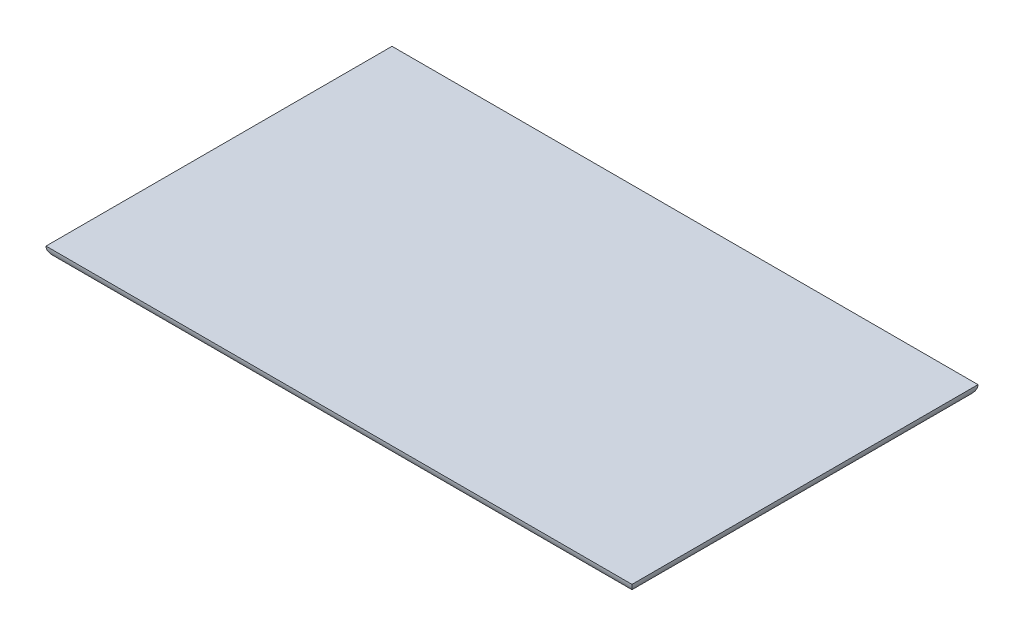
ISO-10303-21;
HEADER;
FILE_DESCRIPTION(('STEP AP214'),'2;1');
FILE_NAME('part.step','',(''),(''),'','','');
FILE_SCHEMA(('AUTOMOTIVE_DESIGN { 1 0 10303 214 1 1 1 1 }'));
ENDSEC;
DATA;
#1=APPLICATION_CONTEXT('core data for automotive mechanical design processes');
#2=APPLICATION_PROTOCOL_DEFINITION('international standard','automotive_design',2000,#1);
#3=PRODUCT_CONTEXT('',#1,'mechanical');
#4=PRODUCT('Part','Part','',(#3));
#5=PRODUCT_RELATED_PRODUCT_CATEGORY('part','',(#4));
#6=PRODUCT_DEFINITION_FORMATION('','',#4);
#7=PRODUCT_DEFINITION_CONTEXT('part definition',#1,'design');
#8=PRODUCT_DEFINITION('design','',#6,#7);
#9=PRODUCT_DEFINITION_SHAPE('','',#8);
#10=(LENGTH_UNIT() NAMED_UNIT(*) SI_UNIT(.MILLI.,.METRE.));
#11=(NAMED_UNIT(*) PLANE_ANGLE_UNIT() SI_UNIT($,.RADIAN.));
#12=(NAMED_UNIT(*) SI_UNIT($,.STERADIAN.) SOLID_ANGLE_UNIT());
#13=UNCERTAINTY_MEASURE_WITH_UNIT(LENGTH_MEASURE(1.E-05),#10,'distance_accuracy_value','');
#14=(GEOMETRIC_REPRESENTATION_CONTEXT(3) GLOBAL_UNCERTAINTY_ASSIGNED_CONTEXT((#13)) GLOBAL_UNIT_ASSIGNED_CONTEXT((#10,
#11,#12)) REPRESENTATION_CONTEXT('',''));
#15=CARTESIAN_POINT('',(0.,0.,0.));
#16=DIRECTION('',(0.,0.,1.));
#17=DIRECTION('',(1.,0.,0.));
#18=AXIS2_PLACEMENT_3D('',#15,#16,#17);
#19=CARTESIAN_POINT('',(0.,2.,0.));
#20=DIRECTION('',(0.,1.,0.));
#21=DIRECTION('',(0.,0.,1.));
#22=AXIS2_PLACEMENT_3D('',#19,#20,#21);
#23=PLANE('',#22);
#24=DIRECTION('',(0.,0.,1.));
#25=VECTOR('',#24,1.);
#26=CARTESIAN_POINT('',(-49.4372039865158,2.,33.7793314440381));
#27=LINE('',#26,#25);
#28=CARTESIAN_POINT('',(-49.4372039865158,2.,-28.2206685534449));
#29=VERTEX_POINT('',#28);
#30=CARTESIAN_POINT('',(-49.4372039865158,2.,33.7793314440381));
#31=VERTEX_POINT('',#30);
#32=EDGE_CURVE('E74',#29,#31,#27,.T.);
#33=ORIENTED_EDGE('',*,*,#32,.T.);
#34=DIRECTION('',(1.,0.,0.));
#35=VECTOR('',#34,1.);
#36=CARTESIAN_POINT('',(55.5627960109672,2.,33.7793314440381));
#37=LINE('',#36,#35);
#38=CARTESIAN_POINT('',(55.5627960109672,2.,33.7793314440381));
#39=VERTEX_POINT('',#38);
#40=EDGE_CURVE('E77',#31,#39,#37,.T.);
#41=ORIENTED_EDGE('',*,*,#40,.T.);
#42=DIRECTION('',(0.,0.,-1.));
#43=VECTOR('',#42,1.);
#44=CARTESIAN_POINT('',(55.5627960109672,2.,33.7793314440381));
#45=LINE('',#44,#43);
#46=CARTESIAN_POINT('',(55.5627960109672,2.,-28.2206685534449));
#47=VERTEX_POINT('',#46);
#48=EDGE_CURVE('E95',#39,#47,#45,.T.);
#49=ORIENTED_EDGE('',*,*,#48,.T.);
#50=DIRECTION('',(-1.,0.,0.));
#51=VECTOR('',#50,1.);
#52=CARTESIAN_POINT('',(55.5627960109672,2.,-28.2206685534449));
#53=LINE('',#52,#51);
#54=EDGE_CURVE('E79',#47,#29,#53,.T.);
#55=ORIENTED_EDGE('',*,*,#54,.T.);
#56=EDGE_LOOP('',(#33,#41,#49,#55));
#57=FACE_BOUND('',#56,.T.);
#58=ADVANCED_FACE('F33',(#57),#23,.T.);
#59=CARTESIAN_POINT('',(0.,0.,0.));
#60=DIRECTION('',(0.,1.,0.));
#61=DIRECTION('',(0.,0.,1.));
#62=AXIS2_PLACEMENT_3D('',#59,#60,#61);
#63=PLANE('',#62);
#64=DIRECTION('',(0.,0.,-1.));
#65=VECTOR('',#64,1.);
#66=CARTESIAN_POINT('',(53.5627960109672,0.,0.));
#67=LINE('',#66,#65);
#68=CARTESIAN_POINT('',(53.5627960109672,0.,-26.2206685534449));
#69=VERTEX_POINT('',#68);
#70=CARTESIAN_POINT('',(53.5627960109672,0.,31.7793314440381));
#71=VERTEX_POINT('',#70);
#72=EDGE_CURVE('E42',#69,#71,#67,.F.);
#73=ORIENTED_EDGE('',*,*,#72,.T.);
#74=DIRECTION('',(1.,0.,0.));
#75=VECTOR('',#74,1.);
#76=CARTESIAN_POINT('',(0.,0.,31.7793314440381));
#77=LINE('',#76,#75);
#78=CARTESIAN_POINT('',(-47.4372039865158,0.,31.7793314440381));
#79=VERTEX_POINT('',#78);
#80=EDGE_CURVE('E11',#71,#79,#77,.F.);
#81=ORIENTED_EDGE('',*,*,#80,.T.);
#82=DIRECTION('',(0.,0.,1.));
#83=VECTOR('',#82,1.);
#84=CARTESIAN_POINT('',(-47.4372039865158,0.,0.));
#85=LINE('',#84,#83);
#86=CARTESIAN_POINT('',(-47.4372039865158,0.,-26.2206685534449));
#87=VERTEX_POINT('',#86);
#88=EDGE_CURVE('E87',#79,#87,#85,.F.);
#89=ORIENTED_EDGE('',*,*,#88,.T.);
#90=DIRECTION('',(-1.,0.,0.));
#91=VECTOR('',#90,1.);
#92=CARTESIAN_POINT('',(0.,0.,-26.2206685534449));
#93=LINE('',#92,#91);
#94=EDGE_CURVE('E53',#87,#69,#93,.F.);
#95=ORIENTED_EDGE('',*,*,#94,.T.);
#96=EDGE_LOOP('',(#73,#81,#89,#95));
#97=FACE_BOUND('',#96,.T.);
#98=ADVANCED_FACE('F115',(#97),#63,.F.);
#99=CARTESIAN_POINT('',(55.5627960109672,2.,-26.2206685534449));
#100=DIRECTION('',(-1.,0.,0.));
#101=DIRECTION('',(0.,0.,1.));
#102=AXIS2_PLACEMENT_3D('',#99,#100,#101);
#103=CYLINDRICAL_SURFACE('',#102,2.);
#104=CARTESIAN_POINT('',(53.5627960109672,2.,-26.2206685534449));
#105=DIRECTION('',(-0.707106781186547,0.,-0.707106781186548));
#106=DIRECTION('',(-0.707106781186548,0.,0.707106781186547));
#107=AXIS2_PLACEMENT_3D('',#104,#105,#106);
#108=ELLIPSE('',#107,2.82842712474619,2.);
#109=EDGE_CURVE('E89',#69,#47,#108,.F.);
#110=ORIENTED_EDGE('',*,*,#109,.F.);
#111=ORIENTED_EDGE('',*,*,#94,.F.);
#112=CARTESIAN_POINT('',(-47.4372039865158,2.,-26.2206685534449));
#113=DIRECTION('',(-0.707106781186547,0.,0.707106781186547));
#114=DIRECTION('',(0.707106781186547,0.,0.707106781186547));
#115=AXIS2_PLACEMENT_3D('',#112,#113,#114);
#116=ELLIPSE('',#115,2.82842712474619,2.);
#117=EDGE_CURVE('E37',#29,#87,#116,.T.);
#118=ORIENTED_EDGE('',*,*,#117,.F.);
#119=ORIENTED_EDGE('',*,*,#54,.F.);
#120=EDGE_LOOP('',(#110,#111,#118,#119));
#121=FACE_BOUND('',#120,.T.);
#122=ADVANCED_FACE('F35',(#121),#103,.T.);
#123=CARTESIAN_POINT('',(-47.4372039865158,2.,33.7793314440381));
#124=DIRECTION('',(0.,0.,1.));
#125=DIRECTION('',(1.,0.,0.));
#126=AXIS2_PLACEMENT_3D('',#123,#124,#125);
#127=CYLINDRICAL_SURFACE('',#126,2.);
#128=ORIENTED_EDGE('',*,*,#117,.T.);
#129=ORIENTED_EDGE('',*,*,#88,.F.);
#130=CARTESIAN_POINT('',(-47.4372039865158,2.,31.7793314440381));
#131=DIRECTION('',(0.707106781186548,0.,0.707106781186547));
#132=DIRECTION('',(-0.707106781186547,0.,0.707106781186548));
#133=AXIS2_PLACEMENT_3D('',#130,#131,#132);
#134=ELLIPSE('',#133,2.82842712474619,2.);
#135=EDGE_CURVE('E85',#31,#79,#134,.T.);
#136=ORIENTED_EDGE('',*,*,#135,.F.);
#137=ORIENTED_EDGE('',*,*,#32,.F.);
#138=EDGE_LOOP('',(#128,#129,#136,#137));
#139=FACE_BOUND('',#138,.T.);
#140=ADVANCED_FACE('F86',(#139),#127,.T.);
#141=CARTESIAN_POINT('',(53.5627960109672,2.,33.7793314440381));
#142=DIRECTION('',(0.,0.,-1.));
#143=DIRECTION('',(-1.,0.,0.));
#144=AXIS2_PLACEMENT_3D('',#141,#142,#143);
#145=CYLINDRICAL_SURFACE('',#144,2.);
#146=ORIENTED_EDGE('',*,*,#109,.T.);
#147=ORIENTED_EDGE('',*,*,#48,.F.);
#148=CARTESIAN_POINT('',(53.5627960109672,2.,31.7793314440381));
#149=DIRECTION('',(0.707106781186547,0.,-0.707106781186547));
#150=DIRECTION('',(-0.707106781186547,0.,-0.707106781186547));
#151=AXIS2_PLACEMENT_3D('',#148,#149,#150);
#152=ELLIPSE('',#151,2.82842712474619,2.);
#153=EDGE_CURVE('E90',#71,#39,#152,.F.);
#154=ORIENTED_EDGE('',*,*,#153,.F.);
#155=ORIENTED_EDGE('',*,*,#72,.F.);
#156=EDGE_LOOP('',(#146,#147,#154,#155));
#157=FACE_BOUND('',#156,.T.);
#158=ADVANCED_FACE('F106',(#157),#145,.T.);
#159=CARTESIAN_POINT('',(55.5627960109672,2.,31.7793314440381));
#160=DIRECTION('',(1.,0.,0.));
#161=DIRECTION('',(0.,0.,-1.));
#162=AXIS2_PLACEMENT_3D('',#159,#160,#161);
#163=CYLINDRICAL_SURFACE('',#162,2.);
#164=ORIENTED_EDGE('',*,*,#135,.T.);
#165=ORIENTED_EDGE('',*,*,#80,.F.);
#166=ORIENTED_EDGE('',*,*,#153,.T.);
#167=ORIENTED_EDGE('',*,*,#40,.F.);
#168=EDGE_LOOP('',(#164,#165,#166,#167));
#169=FACE_BOUND('',#168,.T.);
#170=ADVANCED_FACE('F92',(#169),#163,.T.);
#171=CLOSED_SHELL('',(#58,#98,#122,#140,#158,#170));
#172=MANIFOLD_SOLID_BREP('B2',#171);
#173=ADVANCED_BREP_SHAPE_REPRESENTATION('',(#18,#172),#14);
#174=SHAPE_DEFINITION_REPRESENTATION(#9,#173);
ENDSEC;
END-ISO-10303-21;
